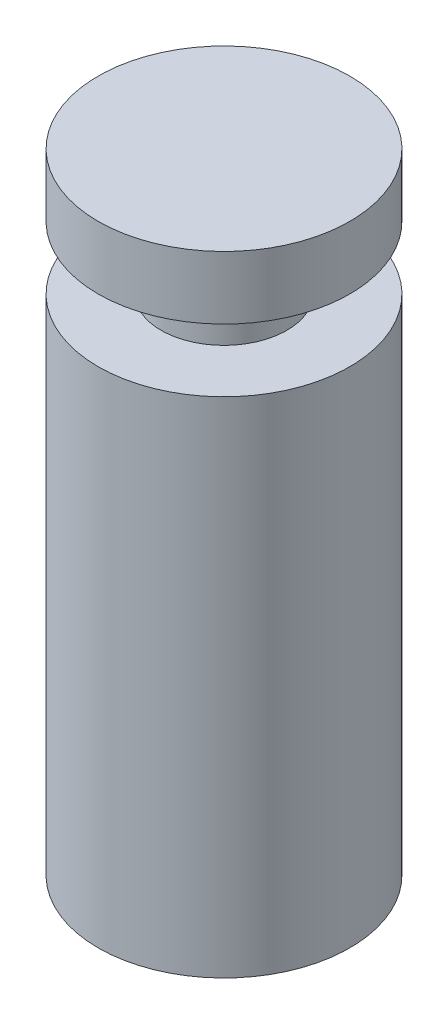
ISO-10303-21;
HEADER;
FILE_DESCRIPTION(('STEP AP214'),'2;1');
FILE_NAME('part.step','',(''),(''),'','','');
FILE_SCHEMA(('AUTOMOTIVE_DESIGN { 1 0 10303 214 1 1 1 1 }'));
ENDSEC;
DATA;
#1=APPLICATION_CONTEXT('core data for automotive mechanical design processes');
#2=APPLICATION_PROTOCOL_DEFINITION('international standard','automotive_design',2000,#1);
#3=PRODUCT_CONTEXT('',#1,'mechanical');
#4=PRODUCT('Part','Part','',(#3));
#5=PRODUCT_RELATED_PRODUCT_CATEGORY('part','',(#4));
#6=PRODUCT_DEFINITION_FORMATION('','',#4);
#7=PRODUCT_DEFINITION_CONTEXT('part definition',#1,'design');
#8=PRODUCT_DEFINITION('design','',#6,#7);
#9=PRODUCT_DEFINITION_SHAPE('','',#8);
#10=(LENGTH_UNIT() NAMED_UNIT(*) SI_UNIT(.MILLI.,.METRE.));
#11=(NAMED_UNIT(*) PLANE_ANGLE_UNIT() SI_UNIT($,.RADIAN.));
#12=(NAMED_UNIT(*) SI_UNIT($,.STERADIAN.) SOLID_ANGLE_UNIT());
#13=UNCERTAINTY_MEASURE_WITH_UNIT(LENGTH_MEASURE(1.E-05),#10,'distance_accuracy_value','');
#14=(GEOMETRIC_REPRESENTATION_CONTEXT(3) GLOBAL_UNCERTAINTY_ASSIGNED_CONTEXT((#13)) GLOBAL_UNIT_ASSIGNED_CONTEXT((#10,
#11,#12)) REPRESENTATION_CONTEXT('',''));
#15=CARTESIAN_POINT('',(0.,0.,0.));
#16=DIRECTION('',(0.,0.,1.));
#17=DIRECTION('',(1.,0.,0.));
#18=AXIS2_PLACEMENT_3D('',#15,#16,#17);
#19=CARTESIAN_POINT('',(0.,0.,0.));
#20=DIRECTION('',(0.,-1.,0.));
#21=DIRECTION('',(0.,0.,-1.));
#22=AXIS2_PLACEMENT_3D('',#19,#20,#21);
#23=PLANE('',#22);
#24=CARTESIAN_POINT('',(0.,0.,0.));
#25=DIRECTION('',(0.,-1.,0.));
#26=DIRECTION('',(0.,0.,-1.));
#27=AXIS2_PLACEMENT_3D('',#24,#25,#26);
#28=CIRCLE('',#27,4.);
#29=CARTESIAN_POINT('',(0.,0.,-4.));
#30=VERTEX_POINT('',#29);
#31=EDGE_CURVE('E68',#30,#30,#28,.T.);
#32=ORIENTED_EDGE('',*,*,#31,.T.);
#33=EDGE_LOOP('',(#32));
#34=FACE_BOUND('',#33,.T.);
#35=ADVANCED_FACE('F41',(#34),#23,.T.);
#36=CARTESIAN_POINT('',(0.,20.,0.));
#37=DIRECTION('',(0.,1.,0.));
#38=DIRECTION('',(0.,0.,1.));
#39=AXIS2_PLACEMENT_3D('',#36,#37,#38);
#40=PLANE('',#39);
#41=CARTESIAN_POINT('',(0.,20.,0.));
#42=DIRECTION('',(0.,-1.,0.));
#43=DIRECTION('',(0.,0.,-1.));
#44=AXIS2_PLACEMENT_3D('',#41,#42,#43);
#45=CIRCLE('',#44,4.);
#46=CARTESIAN_POINT('',(0.,20.,-4.));
#47=VERTEX_POINT('',#46);
#48=EDGE_CURVE('E10',#47,#47,#45,.T.);
#49=ORIENTED_EDGE('',*,*,#48,.F.);
#50=EDGE_LOOP('',(#49));
#51=FACE_BOUND('',#50,.T.);
#52=ADVANCED_FACE('F86',(#51),#40,.T.);
#53=CARTESIAN_POINT('',(0.,0.,0.));
#54=DIRECTION('',(0.,-1.,0.));
#55=DIRECTION('',(0.,0.,-1.));
#56=AXIS2_PLACEMENT_3D('',#53,#54,#55);
#57=CYLINDRICAL_SURFACE('',#56,4.);
#58=ORIENTED_EDGE('',*,*,#48,.T.);
#59=EDGE_LOOP('',(#58));
#60=FACE_BOUND('',#59,.T.);
#61=CARTESIAN_POINT('',(0.,18.,0.));
#62=DIRECTION('',(0.,-1.,0.));
#63=DIRECTION('',(0.,0.,-1.));
#64=AXIS2_PLACEMENT_3D('',#61,#62,#63);
#65=CIRCLE('',#64,4.);
#66=CARTESIAN_POINT('',(0.,18.,-4.));
#67=VERTEX_POINT('',#66);
#68=EDGE_CURVE('E48',#67,#67,#65,.T.);
#69=ORIENTED_EDGE('',*,*,#68,.F.);
#70=EDGE_LOOP('',(#69));
#71=FACE_BOUND('',#70,.T.);
#72=ADVANCED_FACE('F90',(#60,#71),#57,.T.);
#73=CARTESIAN_POINT('',(0.,18.,-4.));
#74=DIRECTION('',(0.,-1.,0.));
#75=DIRECTION('',(0.,0.,-1.));
#76=AXIS2_PLACEMENT_3D('',#73,#74,#75);
#77=PLANE('',#76);
#78=ORIENTED_EDGE('',*,*,#68,.T.);
#79=EDGE_LOOP('',(#78));
#80=FACE_BOUND('',#79,.T.);
#81=CARTESIAN_POINT('',(0.,18.,0.));
#82=DIRECTION('',(0.,-1.,0.));
#83=DIRECTION('',(0.,0.,-1.));
#84=AXIS2_PLACEMENT_3D('',#81,#82,#83);
#85=CIRCLE('',#84,2.);
#86=CARTESIAN_POINT('',(0.,18.,-2.));
#87=VERTEX_POINT('',#86);
#88=EDGE_CURVE('E53',#87,#87,#85,.T.);
#89=ORIENTED_EDGE('',*,*,#88,.F.);
#90=EDGE_LOOP('',(#89));
#91=FACE_BOUND('',#90,.T.);
#92=ADVANCED_FACE('F95',(#80,#91),#77,.T.);
#93=CARTESIAN_POINT('',(0.,0.,0.));
#94=DIRECTION('',(0.,-1.,0.));
#95=DIRECTION('',(0.,0.,-1.));
#96=AXIS2_PLACEMENT_3D('',#93,#94,#95);
#97=CYLINDRICAL_SURFACE('',#96,2.);
#98=ORIENTED_EDGE('',*,*,#88,.T.);
#99=EDGE_LOOP('',(#98));
#100=FACE_BOUND('',#99,.T.);
#101=CARTESIAN_POINT('',(0.,16.,0.));
#102=DIRECTION('',(0.,-1.,0.));
#103=DIRECTION('',(0.,0.,-1.));
#104=AXIS2_PLACEMENT_3D('',#101,#102,#103);
#105=CIRCLE('',#104,2.);
#106=CARTESIAN_POINT('',(0.,16.,-2.));
#107=VERTEX_POINT('',#106);
#108=EDGE_CURVE('E58',#107,#107,#105,.T.);
#109=ORIENTED_EDGE('',*,*,#108,.F.);
#110=EDGE_LOOP('',(#109));
#111=FACE_BOUND('',#110,.T.);
#112=ADVANCED_FACE('F82',(#100,#111),#97,.T.);
#113=CARTESIAN_POINT('',(0.,16.,-2.));
#114=DIRECTION('',(0.,1.,0.));
#115=DIRECTION('',(0.,0.,1.));
#116=AXIS2_PLACEMENT_3D('',#113,#114,#115);
#117=PLANE('',#116);
#118=ORIENTED_EDGE('',*,*,#108,.T.);
#119=EDGE_LOOP('',(#118));
#120=FACE_BOUND('',#119,.T.);
#121=CARTESIAN_POINT('',(0.,16.,0.));
#122=DIRECTION('',(0.,-1.,0.));
#123=DIRECTION('',(0.,0.,-1.));
#124=AXIS2_PLACEMENT_3D('',#121,#122,#123);
#125=CIRCLE('',#124,4.);
#126=CARTESIAN_POINT('',(0.,16.,-4.));
#127=VERTEX_POINT('',#126);
#128=EDGE_CURVE('E64',#127,#127,#125,.T.);
#129=ORIENTED_EDGE('',*,*,#128,.F.);
#130=EDGE_LOOP('',(#129));
#131=FACE_BOUND('',#130,.T.);
#132=ADVANCED_FACE('F76',(#120,#131),#117,.T.);
#133=CARTESIAN_POINT('',(0.,0.,0.));
#134=DIRECTION('',(0.,-1.,0.));
#135=DIRECTION('',(0.,0.,-1.));
#136=AXIS2_PLACEMENT_3D('',#133,#134,#135);
#137=CYLINDRICAL_SURFACE('',#136,4.);
#138=ORIENTED_EDGE('',*,*,#128,.T.);
#139=EDGE_LOOP('',(#138));
#140=FACE_BOUND('',#139,.T.);
#141=ORIENTED_EDGE('',*,*,#31,.F.);
#142=EDGE_LOOP('',(#141));
#143=FACE_BOUND('',#142,.T.);
#144=ADVANCED_FACE('F74',(#140,#143),#137,.T.);
#145=CLOSED_SHELL('',(#35,#52,#72,#92,#112,#132,#144));
#146=MANIFOLD_SOLID_BREP('B2',#145);
#147=ADVANCED_BREP_SHAPE_REPRESENTATION('',(#18,#146),#14);
#148=SHAPE_DEFINITION_REPRESENTATION(#9,#147);
ENDSEC;
END-ISO-10303-21;
